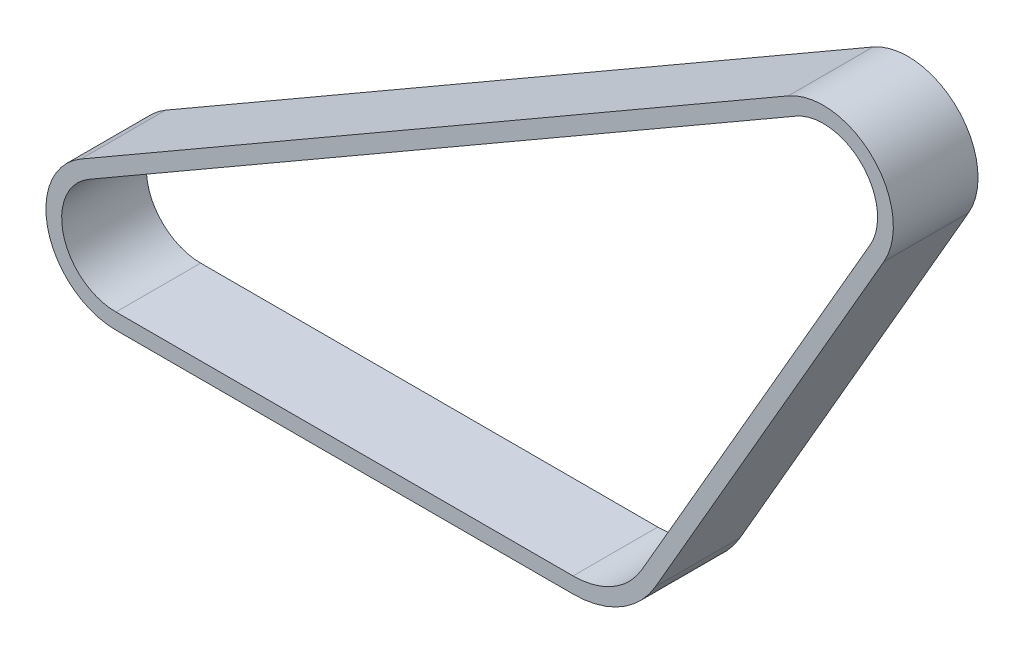
ISO-10303-21;
HEADER;
FILE_DESCRIPTION(('STEP AP214'),'2;1');
FILE_NAME('part.step','',(''),(''),'','','');
FILE_SCHEMA(('AUTOMOTIVE_DESIGN { 1 0 10303 214 1 1 1 1 }'));
ENDSEC;
DATA;
#1=APPLICATION_CONTEXT('core data for automotive mechanical design processes');
#2=APPLICATION_PROTOCOL_DEFINITION('international standard','automotive_design',2000,#1);
#3=PRODUCT_CONTEXT('',#1,'mechanical');
#4=PRODUCT('Part','Part','',(#3));
#5=PRODUCT_RELATED_PRODUCT_CATEGORY('part','',(#4));
#6=PRODUCT_DEFINITION_FORMATION('','',#4);
#7=PRODUCT_DEFINITION_CONTEXT('part definition',#1,'design');
#8=PRODUCT_DEFINITION('design','',#6,#7);
#9=PRODUCT_DEFINITION_SHAPE('','',#8);
#10=(LENGTH_UNIT() NAMED_UNIT(*) SI_UNIT(.MILLI.,.METRE.));
#11=(NAMED_UNIT(*) PLANE_ANGLE_UNIT() SI_UNIT($,.RADIAN.));
#12=(NAMED_UNIT(*) SI_UNIT($,.STERADIAN.) SOLID_ANGLE_UNIT());
#13=UNCERTAINTY_MEASURE_WITH_UNIT(LENGTH_MEASURE(1.E-05),#10,'distance_accuracy_value','');
#14=(GEOMETRIC_REPRESENTATION_CONTEXT(3) GLOBAL_UNCERTAINTY_ASSIGNED_CONTEXT((#13)) GLOBAL_UNIT_ASSIGNED_CONTEXT((#10,
#11,#12)) REPRESENTATION_CONTEXT('',''));
#15=CARTESIAN_POINT('',(0.,0.,0.));
#16=DIRECTION('',(0.,0.,1.));
#17=DIRECTION('',(1.,0.,0.));
#18=AXIS2_PLACEMENT_3D('',#15,#16,#17);
#19=CARTESIAN_POINT('',(0.,0.,17.0815));
#20=DIRECTION('',(0.,0.,1.));
#21=DIRECTION('',(1.,0.,0.));
#22=AXIS2_PLACEMENT_3D('',#19,#20,#21);
#23=PLANE('',#22);
#24=CARTESIAN_POINT('',(0.,0.,17.0815));
#25=DIRECTION('',(0.,0.,1.));
#26=DIRECTION('',(1.,0.,0.));
#27=AXIS2_PLACEMENT_3D('',#24,#25,#26);
#28=CIRCLE('',#27,19.175);
#29=CARTESIAN_POINT('',(0.,-19.175,17.0815));
#30=VERTEX_POINT('',#29);
#31=CARTESIAN_POINT('',(16.6060371175666,-9.58749999999995,17.0815));
#32=VERTEX_POINT('',#31);
#33=EDGE_CURVE('E173',#30,#32,#28,.T.);
#34=ORIENTED_EDGE('',*,*,#33,.T.);
#35=DIRECTION('',(0.499999999999998,0.86602540378444,0.));
#36=VECTOR('',#35,1.);
#37=CARTESIAN_POINT('',(16.6060371175666,-9.58749999999995,17.0815));
#38=LINE('',#37,#36);
#39=CARTESIAN_POINT('',(62.7070371175664,70.261774279733,17.0815));
#40=VERTEX_POINT('',#39);
#41=EDGE_CURVE('E176',#32,#40,#38,.T.);
#42=ORIENTED_EDGE('',*,*,#41,.T.);
#43=CARTESIAN_POINT('',(50.471180693847,77.3261492797329,17.0815));
#44=DIRECTION('',(0.,0.,1.));
#45=DIRECTION('',(1.,0.,0.));
#46=AXIS2_PLACEMENT_3D('',#43,#44,#45);
#47=CIRCLE('',#46,14.12875);
#48=CARTESIAN_POINT('',(43.406805693847,89.5620057034523,17.0815));
#49=VERTEX_POINT('',#48);
#50=EDGE_CURVE('E179',#40,#49,#47,.T.);
#51=ORIENTED_EDGE('',*,*,#50,.T.);
#52=DIRECTION('',(-0.866025403784438,-0.500000000000001,0.));
#53=VECTOR('',#52,1.);
#54=CARTESIAN_POINT('',(43.406805693847,89.5620057034523,17.0815));
#55=LINE('',#54,#53);
#56=CARTESIAN_POINT('',(-99.266375,7.18960642371939,17.0815));
#57=VERTEX_POINT('',#56);
#58=EDGE_CURVE('E181',#49,#57,#55,.T.);
#59=ORIENTED_EDGE('',*,*,#58,.T.);
#60=CARTESIAN_POINT('',(-92.202,-5.04625,17.0815));
#61=DIRECTION('',(0.,0.,1.));
#62=DIRECTION('',(1.,0.,0.));
#63=AXIS2_PLACEMENT_3D('',#60,#61,#62);
#64=CIRCLE('',#63,14.12875);
#65=CARTESIAN_POINT('',(-92.202,-19.175,17.0815));
#66=VERTEX_POINT('',#65);
#67=EDGE_CURVE('E183',#57,#66,#64,.T.);
#68=ORIENTED_EDGE('',*,*,#67,.T.);
#69=DIRECTION('',(1.,0.,0.));
#70=VECTOR('',#69,1.);
#71=CARTESIAN_POINT('',(-92.202,-19.175,17.0815));
#72=LINE('',#71,#70);
#73=EDGE_CURVE('E185',#66,#30,#72,.T.);
#74=ORIENTED_EDGE('',*,*,#73,.T.);
#75=EDGE_LOOP('',(#34,#42,#51,#59,#68,#74));
#76=FACE_BOUND('',#75,.T.);
#77=DIRECTION('',(1.,0.,0.));
#78=VECTOR('',#77,1.);
#79=CARTESIAN_POINT('',(-92.202,-16.,17.0815));
#80=LINE('',#79,#78);
#81=CARTESIAN_POINT('',(-92.202,-16.,17.0815));
#82=VERTEX_POINT('',#81);
#83=CARTESIAN_POINT('',(0.,-16.,17.0815));
#84=VERTEX_POINT('',#83);
#85=EDGE_CURVE('E130',#82,#84,#80,.T.);
#86=ORIENTED_EDGE('',*,*,#85,.F.);
#87=CARTESIAN_POINT('',(-92.202,-5.04625,17.0815));
#88=DIRECTION('',(0.,0.,1.));
#89=DIRECTION('',(1.,0.,0.));
#90=AXIS2_PLACEMENT_3D('',#87,#88,#89);
#91=CIRCLE('',#90,10.95375);
#92=CARTESIAN_POINT('',(-97.678875,4.43997576670378,17.0815));
#93=VERTEX_POINT('',#92);
#94=EDGE_CURVE('E122',#93,#82,#91,.T.);
#95=ORIENTED_EDGE('',*,*,#94,.F.);
#96=DIRECTION('',(-0.866025403784438,-0.500000000000001,0.));
#97=VECTOR('',#96,1.);
#98=CARTESIAN_POINT('',(-97.678875,4.43997576670378,17.0815));
#99=LINE('',#98,#97);
#100=CARTESIAN_POINT('',(44.994305693847,86.8123750464367,17.0815));
#101=VERTEX_POINT('',#100);
#102=EDGE_CURVE('E151',#101,#93,#99,.T.);
#103=ORIENTED_EDGE('',*,*,#102,.F.);
#104=CARTESIAN_POINT('',(50.471180693847,77.3261492797329,17.0815));
#105=DIRECTION('',(0.,0.,1.));
#106=DIRECTION('',(1.,0.,0.));
#107=AXIS2_PLACEMENT_3D('',#104,#105,#106);
#108=CIRCLE('',#107,10.95375);
#109=CARTESIAN_POINT('',(59.9574064605508,71.849274279733,17.0815));
#110=VERTEX_POINT('',#109);
#111=EDGE_CURVE('E149',#110,#101,#108,.T.);
#112=ORIENTED_EDGE('',*,*,#111,.F.);
#113=DIRECTION('',(0.499999999999998,0.86602540378444,0.));
#114=VECTOR('',#113,1.);
#115=CARTESIAN_POINT('',(59.9574064605508,71.849274279733,17.0815));
#116=LINE('',#115,#114);
#117=CARTESIAN_POINT('',(13.856406460551,-7.99999999999997,17.0815));
#118=VERTEX_POINT('',#117);
#119=EDGE_CURVE('E145',#118,#110,#116,.T.);
#120=ORIENTED_EDGE('',*,*,#119,.F.);
#121=CARTESIAN_POINT('',(0.,0.,17.0815));
#122=DIRECTION('',(0.,0.,1.));
#123=DIRECTION('',(1.,0.,0.));
#124=AXIS2_PLACEMENT_3D('',#121,#122,#123);
#125=CIRCLE('',#124,16.);
#126=EDGE_CURVE('E143',#84,#118,#125,.T.);
#127=ORIENTED_EDGE('',*,*,#126,.F.);
#128=EDGE_LOOP('',(#86,#95,#103,#112,#120,#127));
#129=FACE_BOUND('',#128,.T.);
#130=ADVANCED_FACE('F33',(#76,#129),#23,.T.);
#131=CARTESIAN_POINT('',(0.,0.,0.));
#132=DIRECTION('',(0.,0.,1.));
#133=DIRECTION('',(1.,0.,0.));
#134=AXIS2_PLACEMENT_3D('',#131,#132,#133);
#135=PLANE('',#134);
#136=CARTESIAN_POINT('',(0.,0.,0.));
#137=DIRECTION('',(0.,0.,1.));
#138=DIRECTION('',(1.,0.,0.));
#139=AXIS2_PLACEMENT_3D('',#136,#137,#138);
#140=CIRCLE('',#139,19.175);
#141=CARTESIAN_POINT('',(0.,-19.175,0.));
#142=VERTEX_POINT('',#141);
#143=CARTESIAN_POINT('',(16.6060371175666,-9.58749999999995,0.));
#144=VERTEX_POINT('',#143);
#145=EDGE_CURVE('E138',#142,#144,#140,.T.);
#146=ORIENTED_EDGE('',*,*,#145,.F.);
#147=DIRECTION('',(1.,0.,0.));
#148=VECTOR('',#147,1.);
#149=CARTESIAN_POINT('',(-92.202,-19.175,0.));
#150=LINE('',#149,#148);
#151=CARTESIAN_POINT('',(-92.202,-19.175,0.));
#152=VERTEX_POINT('',#151);
#153=EDGE_CURVE('E177',#152,#142,#150,.T.);
#154=ORIENTED_EDGE('',*,*,#153,.F.);
#155=CARTESIAN_POINT('',(-92.202,-5.04625,0.));
#156=DIRECTION('',(0.,0.,1.));
#157=DIRECTION('',(1.,0.,0.));
#158=AXIS2_PLACEMENT_3D('',#155,#156,#157);
#159=CIRCLE('',#158,14.12875);
#160=CARTESIAN_POINT('',(-99.266375,7.18960642371939,0.));
#161=VERTEX_POINT('',#160);
#162=EDGE_CURVE('E196',#161,#152,#159,.T.);
#163=ORIENTED_EDGE('',*,*,#162,.F.);
#164=DIRECTION('',(-0.866025403784438,-0.500000000000001,0.));
#165=VECTOR('',#164,1.);
#166=CARTESIAN_POINT('',(43.406805693847,89.5620057034523,0.));
#167=LINE('',#166,#165);
#168=CARTESIAN_POINT('',(43.406805693847,89.5620057034523,0.));
#169=VERTEX_POINT('',#168);
#170=EDGE_CURVE('E194',#169,#161,#167,.T.);
#171=ORIENTED_EDGE('',*,*,#170,.F.);
#172=CARTESIAN_POINT('',(50.471180693847,77.3261492797329,0.));
#173=DIRECTION('',(0.,0.,1.));
#174=DIRECTION('',(1.,0.,0.));
#175=AXIS2_PLACEMENT_3D('',#172,#173,#174);
#176=CIRCLE('',#175,14.12875);
#177=CARTESIAN_POINT('',(62.7070371175664,70.261774279733,0.));
#178=VERTEX_POINT('',#177);
#179=EDGE_CURVE('E192',#178,#169,#176,.T.);
#180=ORIENTED_EDGE('',*,*,#179,.F.);
#181=DIRECTION('',(0.499999999999998,0.86602540378444,0.));
#182=VECTOR('',#181,1.);
#183=CARTESIAN_POINT('',(16.6060371175666,-9.58749999999995,0.));
#184=LINE('',#183,#182);
#185=EDGE_CURVE('E190',#144,#178,#184,.T.);
#186=ORIENTED_EDGE('',*,*,#185,.F.);
#187=EDGE_LOOP('',(#146,#154,#163,#171,#180,#186));
#188=FACE_BOUND('',#187,.T.);
#189=CARTESIAN_POINT('',(-92.202,-5.04625,0.));
#190=DIRECTION('',(0.,0.,1.));
#191=DIRECTION('',(1.,0.,0.));
#192=AXIS2_PLACEMENT_3D('',#189,#190,#191);
#193=CIRCLE('',#192,10.95375);
#194=CARTESIAN_POINT('',(-97.678875,4.43997576670378,0.));
#195=VERTEX_POINT('',#194);
#196=CARTESIAN_POINT('',(-92.202,-16.,0.));
#197=VERTEX_POINT('',#196);
#198=EDGE_CURVE('E56',#195,#197,#193,.T.);
#199=ORIENTED_EDGE('',*,*,#198,.T.);
#200=DIRECTION('',(1.,0.,0.));
#201=VECTOR('',#200,1.);
#202=CARTESIAN_POINT('',(-92.202,-16.,0.));
#203=LINE('',#202,#201);
#204=CARTESIAN_POINT('',(0.,-16.,0.));
#205=VERTEX_POINT('',#204);
#206=EDGE_CURVE('E137',#197,#205,#203,.T.);
#207=ORIENTED_EDGE('',*,*,#206,.T.);
#208=CARTESIAN_POINT('',(0.,0.,0.));
#209=DIRECTION('',(0.,0.,1.));
#210=DIRECTION('',(1.,0.,0.));
#211=AXIS2_PLACEMENT_3D('',#208,#209,#210);
#212=CIRCLE('',#211,16.);
#213=CARTESIAN_POINT('',(13.856406460551,-7.99999999999997,0.));
#214=VERTEX_POINT('',#213);
#215=EDGE_CURVE('E155',#205,#214,#212,.T.);
#216=ORIENTED_EDGE('',*,*,#215,.T.);
#217=DIRECTION('',(0.499999999999998,0.86602540378444,0.));
#218=VECTOR('',#217,1.);
#219=CARTESIAN_POINT('',(59.9574064605508,71.849274279733,0.));
#220=LINE('',#219,#218);
#221=CARTESIAN_POINT('',(59.9574064605508,71.849274279733,0.));
#222=VERTEX_POINT('',#221);
#223=EDGE_CURVE('E158',#214,#222,#220,.T.);
#224=ORIENTED_EDGE('',*,*,#223,.T.);
#225=CARTESIAN_POINT('',(50.471180693847,77.3261492797329,0.));
#226=DIRECTION('',(0.,0.,1.));
#227=DIRECTION('',(1.,0.,0.));
#228=AXIS2_PLACEMENT_3D('',#225,#226,#227);
#229=CIRCLE('',#228,10.95375);
#230=CARTESIAN_POINT('',(44.994305693847,86.8123750464367,0.));
#231=VERTEX_POINT('',#230);
#232=EDGE_CURVE('E161',#222,#231,#229,.T.);
#233=ORIENTED_EDGE('',*,*,#232,.T.);
#234=DIRECTION('',(-0.866025403784438,-0.500000000000001,0.));
#235=VECTOR('',#234,1.);
#236=CARTESIAN_POINT('',(-97.678875,4.43997576670378,0.));
#237=LINE('',#236,#235);
#238=EDGE_CURVE('E131',#231,#195,#237,.T.);
#239=ORIENTED_EDGE('',*,*,#238,.T.);
#240=EDGE_LOOP('',(#199,#207,#216,#224,#233,#239));
#241=FACE_BOUND('',#240,.T.);
#242=ADVANCED_FACE('F220',(#188,#241),#135,.F.);
#243=CARTESIAN_POINT('',(0.,0.,17.0815));
#244=DIRECTION('',(0.,0.,-1.));
#245=DIRECTION('',(-1.,0.,0.));
#246=AXIS2_PLACEMENT_3D('',#243,#244,#245);
#247=CYLINDRICAL_SURFACE('',#246,19.175);
#248=ORIENTED_EDGE('',*,*,#145,.T.);
#249=DIRECTION('',(0.,0.,-1.));
#250=VECTOR('',#249,1.);
#251=CARTESIAN_POINT('',(16.6060371175666,-9.58749999999995,17.0815));
#252=LINE('',#251,#250);
#253=EDGE_CURVE('E11',#32,#144,#252,.T.);
#254=ORIENTED_EDGE('',*,*,#253,.F.);
#255=ORIENTED_EDGE('',*,*,#33,.F.);
#256=DIRECTION('',(0.,0.,-1.));
#257=VECTOR('',#256,1.);
#258=CARTESIAN_POINT('',(0.,-19.175,17.0815));
#259=LINE('',#258,#257);
#260=EDGE_CURVE('E187',#30,#142,#259,.T.);
#261=ORIENTED_EDGE('',*,*,#260,.T.);
#262=EDGE_LOOP('',(#248,#254,#255,#261));
#263=FACE_BOUND('',#262,.T.);
#264=ADVANCED_FACE('F35',(#263),#247,.T.);
#265=CARTESIAN_POINT('',(16.6060371175666,-9.58749999999995,17.0815));
#266=DIRECTION('',(-0.86602540378444,0.499999999999998,0.));
#267=DIRECTION('',(-0.499999999999998,-0.86602540378444,0.));
#268=AXIS2_PLACEMENT_3D('',#265,#266,#267);
#269=PLANE('',#268);
#270=ORIENTED_EDGE('',*,*,#185,.T.);
#271=DIRECTION('',(0.,0.,-1.));
#272=VECTOR('',#271,1.);
#273=CARTESIAN_POINT('',(62.7070371175664,70.261774279733,17.0815));
#274=LINE('',#273,#272);
#275=EDGE_CURVE('E41',#40,#178,#274,.T.);
#276=ORIENTED_EDGE('',*,*,#275,.F.);
#277=ORIENTED_EDGE('',*,*,#41,.F.);
#278=ORIENTED_EDGE('',*,*,#253,.T.);
#279=EDGE_LOOP('',(#270,#276,#277,#278));
#280=FACE_BOUND('',#279,.T.);
#281=ADVANCED_FACE('F237',(#280),#269,.F.);
#282=CARTESIAN_POINT('',(50.471180693847,77.3261492797329,17.0815));
#283=DIRECTION('',(0.,0.,-1.));
#284=DIRECTION('',(-1.,0.,0.));
#285=AXIS2_PLACEMENT_3D('',#282,#283,#284);
#286=CYLINDRICAL_SURFACE('',#285,14.12875);
#287=ORIENTED_EDGE('',*,*,#179,.T.);
#288=DIRECTION('',(0.,0.,-1.));
#289=VECTOR('',#288,1.);
#290=CARTESIAN_POINT('',(43.406805693847,89.5620057034523,17.0815));
#291=LINE('',#290,#289);
#292=EDGE_CURVE('E207',#49,#169,#291,.T.);
#293=ORIENTED_EDGE('',*,*,#292,.F.);
#294=ORIENTED_EDGE('',*,*,#50,.F.);
#295=ORIENTED_EDGE('',*,*,#275,.T.);
#296=EDGE_LOOP('',(#287,#293,#294,#295));
#297=FACE_BOUND('',#296,.T.);
#298=ADVANCED_FACE('F214',(#297),#286,.T.);
#299=CARTESIAN_POINT('',(43.406805693847,89.5620057034523,17.0815));
#300=DIRECTION('',(0.500000000000001,-0.866025403784438,0.));
#301=DIRECTION('',(0.866025403784438,0.500000000000001,0.));
#302=AXIS2_PLACEMENT_3D('',#299,#300,#301);
#303=PLANE('',#302);
#304=ORIENTED_EDGE('',*,*,#170,.T.);
#305=DIRECTION('',(0.,0.,-1.));
#306=VECTOR('',#305,1.);
#307=CARTESIAN_POINT('',(-99.266375,7.18960642371939,17.0815));
#308=LINE('',#307,#306);
#309=EDGE_CURVE('E204',#57,#161,#308,.T.);
#310=ORIENTED_EDGE('',*,*,#309,.F.);
#311=ORIENTED_EDGE('',*,*,#58,.F.);
#312=ORIENTED_EDGE('',*,*,#292,.T.);
#313=EDGE_LOOP('',(#304,#310,#311,#312));
#314=FACE_BOUND('',#313,.T.);
#315=ADVANCED_FACE('F226',(#314),#303,.F.);
#316=CARTESIAN_POINT('',(-92.202,-5.04625,17.0815));
#317=DIRECTION('',(0.,0.,-1.));
#318=DIRECTION('',(-1.,0.,0.));
#319=AXIS2_PLACEMENT_3D('',#316,#317,#318);
#320=CYLINDRICAL_SURFACE('',#319,14.12875);
#321=ORIENTED_EDGE('',*,*,#162,.T.);
#322=DIRECTION('',(0.,0.,-1.));
#323=VECTOR('',#322,1.);
#324=CARTESIAN_POINT('',(-92.202,-19.175,17.0815));
#325=LINE('',#324,#323);
#326=EDGE_CURVE('E201',#66,#152,#325,.T.);
#327=ORIENTED_EDGE('',*,*,#326,.F.);
#328=ORIENTED_EDGE('',*,*,#67,.F.);
#329=ORIENTED_EDGE('',*,*,#309,.T.);
#330=EDGE_LOOP('',(#321,#327,#328,#329));
#331=FACE_BOUND('',#330,.T.);
#332=ADVANCED_FACE('F230',(#331),#320,.T.);
#333=CARTESIAN_POINT('',(-92.202,-19.175,17.0815));
#334=DIRECTION('',(0.,1.,0.));
#335=DIRECTION('',(0.,0.,1.));
#336=AXIS2_PLACEMENT_3D('',#333,#334,#335);
#337=PLANE('',#336);
#338=ORIENTED_EDGE('',*,*,#153,.T.);
#339=ORIENTED_EDGE('',*,*,#260,.F.);
#340=ORIENTED_EDGE('',*,*,#73,.F.);
#341=ORIENTED_EDGE('',*,*,#326,.T.);
#342=EDGE_LOOP('',(#338,#339,#340,#341));
#343=FACE_BOUND('',#342,.T.);
#344=ADVANCED_FACE('F240',(#343),#337,.F.);
#345=CARTESIAN_POINT('',(-92.202,-5.04625,17.0815));
#346=DIRECTION('',(0.,0.,-1.));
#347=DIRECTION('',(-1.,0.,0.));
#348=AXIS2_PLACEMENT_3D('',#345,#346,#347);
#349=CYLINDRICAL_SURFACE('',#348,10.95375);
#350=ORIENTED_EDGE('',*,*,#198,.F.);
#351=DIRECTION('',(0.,0.,-1.));
#352=VECTOR('',#351,1.);
#353=CARTESIAN_POINT('',(-97.678875,4.43997576670378,17.0815));
#354=LINE('',#353,#352);
#355=EDGE_CURVE('E126',#93,#195,#354,.T.);
#356=ORIENTED_EDGE('',*,*,#355,.F.);
#357=ORIENTED_EDGE('',*,*,#94,.T.);
#358=DIRECTION('',(0.,0.,-1.));
#359=VECTOR('',#358,1.);
#360=CARTESIAN_POINT('',(-92.202,-16.,17.0815));
#361=LINE('',#360,#359);
#362=EDGE_CURVE('E125',#82,#197,#361,.T.);
#363=ORIENTED_EDGE('',*,*,#362,.T.);
#364=EDGE_LOOP('',(#350,#356,#357,#363));
#365=FACE_BOUND('',#364,.T.);
#366=ADVANCED_FACE('F124',(#365),#349,.F.);
#367=CARTESIAN_POINT('',(-92.202,-16.,17.0815));
#368=DIRECTION('',(0.,1.,0.));
#369=DIRECTION('',(0.,0.,1.));
#370=AXIS2_PLACEMENT_3D('',#367,#368,#369);
#371=PLANE('',#370);
#372=ORIENTED_EDGE('',*,*,#206,.F.);
#373=ORIENTED_EDGE('',*,*,#362,.F.);
#374=ORIENTED_EDGE('',*,*,#85,.T.);
#375=DIRECTION('',(0.,0.,-1.));
#376=VECTOR('',#375,1.);
#377=CARTESIAN_POINT('',(0.,-16.,17.0815));
#378=LINE('',#377,#376);
#379=EDGE_CURVE('E139',#84,#205,#378,.T.);
#380=ORIENTED_EDGE('',*,*,#379,.T.);
#381=EDGE_LOOP('',(#372,#373,#374,#380));
#382=FACE_BOUND('',#381,.T.);
#383=ADVANCED_FACE('F134',(#382),#371,.T.);
#384=CARTESIAN_POINT('',(0.,0.,17.0815));
#385=DIRECTION('',(0.,0.,-1.));
#386=DIRECTION('',(-1.,0.,0.));
#387=AXIS2_PLACEMENT_3D('',#384,#385,#386);
#388=CYLINDRICAL_SURFACE('',#387,16.);
#389=ORIENTED_EDGE('',*,*,#215,.F.);
#390=ORIENTED_EDGE('',*,*,#379,.F.);
#391=ORIENTED_EDGE('',*,*,#126,.T.);
#392=DIRECTION('',(0.,0.,-1.));
#393=VECTOR('',#392,1.);
#394=CARTESIAN_POINT('',(13.856406460551,-7.99999999999997,17.0815));
#395=LINE('',#394,#393);
#396=EDGE_CURVE('E170',#118,#214,#395,.T.);
#397=ORIENTED_EDGE('',*,*,#396,.T.);
#398=EDGE_LOOP('',(#389,#390,#391,#397));
#399=FACE_BOUND('',#398,.T.);
#400=ADVANCED_FACE('F258',(#399),#388,.F.);
#401=CARTESIAN_POINT('',(59.9574064605508,71.849274279733,17.0815));
#402=DIRECTION('',(-0.86602540378444,0.499999999999998,0.));
#403=DIRECTION('',(-0.499999999999998,-0.86602540378444,0.));
#404=AXIS2_PLACEMENT_3D('',#401,#402,#403);
#405=PLANE('',#404);
#406=ORIENTED_EDGE('',*,*,#223,.F.);
#407=ORIENTED_EDGE('',*,*,#396,.F.);
#408=ORIENTED_EDGE('',*,*,#119,.T.);
#409=DIRECTION('',(0.,0.,-1.));
#410=VECTOR('',#409,1.);
#411=CARTESIAN_POINT('',(59.9574064605508,71.849274279733,17.0815));
#412=LINE('',#411,#410);
#413=EDGE_CURVE('E168',#110,#222,#412,.T.);
#414=ORIENTED_EDGE('',*,*,#413,.T.);
#415=EDGE_LOOP('',(#406,#407,#408,#414));
#416=FACE_BOUND('',#415,.T.);
#417=ADVANCED_FACE('F261',(#416),#405,.T.);
#418=CARTESIAN_POINT('',(50.471180693847,77.3261492797329,17.0815));
#419=DIRECTION('',(0.,0.,-1.));
#420=DIRECTION('',(-1.,0.,0.));
#421=AXIS2_PLACEMENT_3D('',#418,#419,#420);
#422=CYLINDRICAL_SURFACE('',#421,10.95375);
#423=ORIENTED_EDGE('',*,*,#232,.F.);
#424=ORIENTED_EDGE('',*,*,#413,.F.);
#425=ORIENTED_EDGE('',*,*,#111,.T.);
#426=DIRECTION('',(0.,0.,-1.));
#427=VECTOR('',#426,1.);
#428=CARTESIAN_POINT('',(44.994305693847,86.8123750464367,17.0815));
#429=LINE('',#428,#427);
#430=EDGE_CURVE('E48',#101,#231,#429,.T.);
#431=ORIENTED_EDGE('',*,*,#430,.T.);
#432=EDGE_LOOP('',(#423,#424,#425,#431));
#433=FACE_BOUND('',#432,.T.);
#434=ADVANCED_FACE('F265',(#433),#422,.F.);
#435=CARTESIAN_POINT('',(-97.678875,4.43997576670378,17.0815));
#436=DIRECTION('',(0.500000000000001,-0.866025403784438,0.));
#437=DIRECTION('',(0.866025403784438,0.500000000000001,0.));
#438=AXIS2_PLACEMENT_3D('',#435,#436,#437);
#439=PLANE('',#438);
#440=ORIENTED_EDGE('',*,*,#238,.F.);
#441=ORIENTED_EDGE('',*,*,#430,.F.);
#442=ORIENTED_EDGE('',*,*,#102,.T.);
#443=ORIENTED_EDGE('',*,*,#355,.T.);
#444=EDGE_LOOP('',(#440,#441,#442,#443));
#445=FACE_BOUND('',#444,.T.);
#446=ADVANCED_FACE('F269',(#445),#439,.T.);
#447=CLOSED_SHELL('',(#130,#242,#264,#281,#298,#315,#332,#344,#366,#383,#400,#417,#434,#446));
#448=MANIFOLD_SOLID_BREP('B2',#447);
#449=ADVANCED_BREP_SHAPE_REPRESENTATION('',(#18,#448),#14);
#450=SHAPE_DEFINITION_REPRESENTATION(#9,#449);
ENDSEC;
END-ISO-10303-21;
